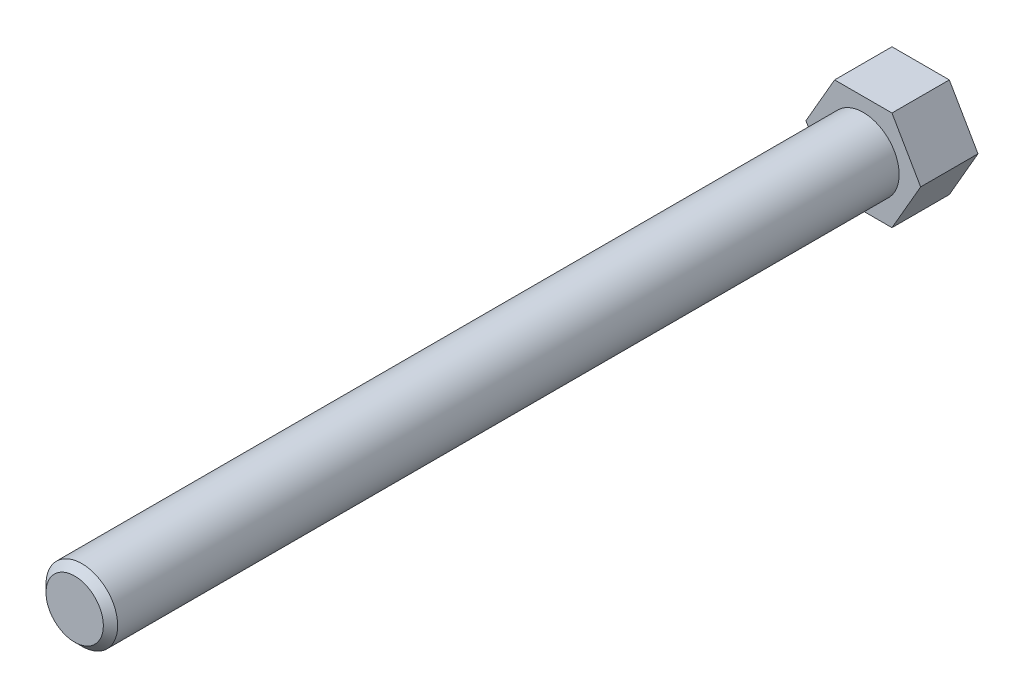
ISO-10303-21;
HEADER;
FILE_DESCRIPTION(('STEP AP214'),'2;1');
FILE_NAME('part.step','',(''),(''),'','','');
FILE_SCHEMA(('AUTOMOTIVE_DESIGN { 1 0 10303 214 1 1 1 1 }'));
ENDSEC;
DATA;
#1=APPLICATION_CONTEXT('core data for automotive mechanical design processes');
#2=APPLICATION_PROTOCOL_DEFINITION('international standard','automotive_design',2000,#1);
#3=PRODUCT_CONTEXT('',#1,'mechanical');
#4=PRODUCT('Part','Part','',(#3));
#5=PRODUCT_RELATED_PRODUCT_CATEGORY('part','',(#4));
#6=PRODUCT_DEFINITION_FORMATION('','',#4);
#7=PRODUCT_DEFINITION_CONTEXT('part definition',#1,'design');
#8=PRODUCT_DEFINITION('design','',#6,#7);
#9=PRODUCT_DEFINITION_SHAPE('','',#8);
#10=(LENGTH_UNIT() NAMED_UNIT(*) SI_UNIT(.MILLI.,.METRE.));
#11=(NAMED_UNIT(*) PLANE_ANGLE_UNIT() SI_UNIT($,.RADIAN.));
#12=(NAMED_UNIT(*) SI_UNIT($,.STERADIAN.) SOLID_ANGLE_UNIT());
#13=UNCERTAINTY_MEASURE_WITH_UNIT(LENGTH_MEASURE(1.E-05),#10,'distance_accuracy_value','');
#14=(GEOMETRIC_REPRESENTATION_CONTEXT(3) GLOBAL_UNCERTAINTY_ASSIGNED_CONTEXT((#13)) GLOBAL_UNIT_ASSIGNED_CONTEXT((#10,
#11,#12)) REPRESENTATION_CONTEXT('',''));
#15=CARTESIAN_POINT('',(0.,0.,0.));
#16=DIRECTION('',(0.,0.,1.));
#17=DIRECTION('',(1.,0.,0.));
#18=AXIS2_PLACEMENT_3D('',#15,#16,#17);
#19=CARTESIAN_POINT('',(0.,0.,55.));
#20=DIRECTION('',(0.,0.,-1.));
#21=DIRECTION('',(-1.,0.,0.));
#22=AXIS2_PLACEMENT_3D('',#19,#20,#21);
#23=CYLINDRICAL_SURFACE('',#22,2.5);
#24=CARTESIAN_POINT('',(0.,0.,54.5));
#25=DIRECTION('',(0.,0.,1.));
#26=DIRECTION('',(1.,0.,0.));
#27=AXIS2_PLACEMENT_3D('',#24,#25,#26);
#28=CIRCLE('',#27,2.5);
#29=CARTESIAN_POINT('',(2.5,0.,54.5));
#30=VERTEX_POINT('',#29);
#31=EDGE_CURVE('E11',#30,#30,#28,.F.);
#32=ORIENTED_EDGE('',*,*,#31,.T.);
#33=EDGE_LOOP('',(#32));
#34=FACE_BOUND('',#33,.T.);
#35=CARTESIAN_POINT('',(0.,0.,0.));
#36=DIRECTION('',(0.,0.,1.));
#37=DIRECTION('',(1.,0.,0.));
#38=AXIS2_PLACEMENT_3D('',#35,#36,#37);
#39=CIRCLE('',#38,2.5);
#40=CARTESIAN_POINT('',(2.5,0.,0.));
#41=VERTEX_POINT('',#40);
#42=EDGE_CURVE('E163',#41,#41,#39,.T.);
#43=ORIENTED_EDGE('',*,*,#42,.T.);
#44=EDGE_LOOP('',(#43));
#45=FACE_BOUND('',#44,.T.);
#46=ADVANCED_FACE('F49',(#34,#45),#23,.T.);
#47=CARTESIAN_POINT('',(0.,0.,55.));
#48=DIRECTION('',(0.,0.,1.));
#49=DIRECTION('',(1.,0.,0.));
#50=AXIS2_PLACEMENT_3D('',#47,#48,#49);
#51=PLANE('',#50);
#52=CARTESIAN_POINT('',(0.,0.,55.));
#53=DIRECTION('',(0.,0.,1.));
#54=DIRECTION('',(1.,0.,0.));
#55=AXIS2_PLACEMENT_3D('',#52,#53,#54);
#56=CIRCLE('',#55,2.);
#57=CARTESIAN_POINT('',(2.,0.,55.));
#58=VERTEX_POINT('',#57);
#59=EDGE_CURVE('E57',#58,#58,#56,.T.);
#60=ORIENTED_EDGE('',*,*,#59,.T.);
#61=EDGE_LOOP('',(#60));
#62=FACE_BOUND('',#61,.T.);
#63=ADVANCED_FACE('F181',(#62),#51,.T.);
#64=CARTESIAN_POINT('',(2.,-3.46410161513776,0.));
#65=DIRECTION('',(0.,0.,1.));
#66=DIRECTION('',(1.,0.,0.));
#67=AXIS2_PLACEMENT_3D('',#64,#65,#66);
#68=PLANE('',#67);
#69=DIRECTION('',(1.,0.,0.));
#70=VECTOR('',#69,1.);
#71=CARTESIAN_POINT('',(-2.,-3.46410161513775,0.));
#72=LINE('',#71,#70);
#73=CARTESIAN_POINT('',(-2.,-3.46410161513775,0.));
#74=VERTEX_POINT('',#73);
#75=CARTESIAN_POINT('',(2.,-3.46410161513776,0.));
#76=VERTEX_POINT('',#75);
#77=EDGE_CURVE('E105',#74,#76,#72,.T.);
#78=ORIENTED_EDGE('',*,*,#77,.T.);
#79=DIRECTION('',(0.5,0.866025403784439,0.));
#80=VECTOR('',#79,1.);
#81=CARTESIAN_POINT('',(2.,-3.46410161513776,0.));
#82=LINE('',#81,#80);
#83=CARTESIAN_POINT('',(4.,0.,0.));
#84=VERTEX_POINT('',#83);
#85=EDGE_CURVE('E116',#76,#84,#82,.T.);
#86=ORIENTED_EDGE('',*,*,#85,.T.);
#87=DIRECTION('',(-0.5,0.866025403784439,0.));
#88=VECTOR('',#87,1.);
#89=CARTESIAN_POINT('',(4.,0.,0.));
#90=LINE('',#89,#88);
#91=CARTESIAN_POINT('',(2.,3.46410161513776,0.));
#92=VERTEX_POINT('',#91);
#93=EDGE_CURVE('E122',#84,#92,#90,.T.);
#94=ORIENTED_EDGE('',*,*,#93,.T.);
#95=DIRECTION('',(-1.,0.,0.));
#96=VECTOR('',#95,1.);
#97=CARTESIAN_POINT('',(2.,3.46410161513776,0.));
#98=LINE('',#97,#96);
#99=CARTESIAN_POINT('',(-2.,3.46410161513776,0.));
#100=VERTEX_POINT('',#99);
#101=EDGE_CURVE('E134',#92,#100,#98,.T.);
#102=ORIENTED_EDGE('',*,*,#101,.T.);
#103=DIRECTION('',(-0.5,-0.866025403784438,0.));
#104=VECTOR('',#103,1.);
#105=CARTESIAN_POINT('',(-2.,3.46410161513776,0.));
#106=LINE('',#105,#104);
#107=CARTESIAN_POINT('',(-4.,0.,0.));
#108=VERTEX_POINT('',#107);
#109=EDGE_CURVE('E138',#100,#108,#106,.T.);
#110=ORIENTED_EDGE('',*,*,#109,.T.);
#111=DIRECTION('',(0.5,-0.866025403784439,0.));
#112=VECTOR('',#111,1.);
#113=CARTESIAN_POINT('',(-4.,0.,0.));
#114=LINE('',#113,#112);
#115=EDGE_CURVE('E127',#108,#74,#114,.T.);
#116=ORIENTED_EDGE('',*,*,#115,.T.);
#117=EDGE_LOOP('',(#78,#86,#94,#102,#110,#116));
#118=FACE_BOUND('',#117,.T.);
#119=ORIENTED_EDGE('',*,*,#42,.F.);
#120=EDGE_LOOP('',(#119));
#121=FACE_BOUND('',#120,.T.);
#122=ADVANCED_FACE('F124',(#118,#121),#68,.T.);
#123=CARTESIAN_POINT('',(-2.,-3.46410161513775,-4.));
#124=DIRECTION('',(0.,-1.,0.));
#125=DIRECTION('',(1.,0.,0.));
#126=AXIS2_PLACEMENT_3D('',#123,#124,#125);
#127=PLANE('',#126);
#128=ORIENTED_EDGE('',*,*,#77,.F.);
#129=DIRECTION('',(0.,0.,1.));
#130=VECTOR('',#129,1.);
#131=CARTESIAN_POINT('',(-2.,-3.46410161513775,-4.));
#132=LINE('',#131,#130);
#133=CARTESIAN_POINT('',(-2.,-3.46410161513775,-4.));
#134=VERTEX_POINT('',#133);
#135=EDGE_CURVE('E64',#134,#74,#132,.T.);
#136=ORIENTED_EDGE('',*,*,#135,.F.);
#137=DIRECTION('',(1.,0.,0.));
#138=VECTOR('',#137,1.);
#139=CARTESIAN_POINT('',(-2.,-3.46410161513775,-4.));
#140=LINE('',#139,#138);
#141=CARTESIAN_POINT('',(2.,-3.46410161513776,-4.));
#142=VERTEX_POINT('',#141);
#143=EDGE_CURVE('E107',#134,#142,#140,.T.);
#144=ORIENTED_EDGE('',*,*,#143,.T.);
#145=DIRECTION('',(0.,0.,1.));
#146=VECTOR('',#145,1.);
#147=CARTESIAN_POINT('',(2.,-3.46410161513776,-4.));
#148=LINE('',#147,#146);
#149=EDGE_CURVE('E101',#142,#76,#148,.T.);
#150=ORIENTED_EDGE('',*,*,#149,.T.);
#151=EDGE_LOOP('',(#128,#136,#144,#150));
#152=FACE_BOUND('',#151,.T.);
#153=ADVANCED_FACE('F103',(#152),#127,.T.);
#154=CARTESIAN_POINT('',(-4.,0.,-4.));
#155=DIRECTION('',(-0.866025403784439,-0.5,0.));
#156=DIRECTION('',(0.5,-0.866025403784439,0.));
#157=AXIS2_PLACEMENT_3D('',#154,#155,#156);
#158=PLANE('',#157);
#159=ORIENTED_EDGE('',*,*,#115,.F.);
#160=DIRECTION('',(0.,0.,1.));
#161=VECTOR('',#160,1.);
#162=CARTESIAN_POINT('',(-4.,0.,-4.));
#163=LINE('',#162,#161);
#164=CARTESIAN_POINT('',(-4.,0.,-4.));
#165=VERTEX_POINT('',#164);
#166=EDGE_CURVE('E72',#165,#108,#163,.T.);
#167=ORIENTED_EDGE('',*,*,#166,.F.);
#168=DIRECTION('',(0.5,-0.866025403784439,0.));
#169=VECTOR('',#168,1.);
#170=CARTESIAN_POINT('',(-4.,0.,-4.));
#171=LINE('',#170,#169);
#172=EDGE_CURVE('E113',#165,#134,#171,.T.);
#173=ORIENTED_EDGE('',*,*,#172,.T.);
#174=ORIENTED_EDGE('',*,*,#135,.T.);
#175=EDGE_LOOP('',(#159,#167,#173,#174));
#176=FACE_BOUND('',#175,.T.);
#177=ADVANCED_FACE('F206',(#176),#158,.T.);
#178=CARTESIAN_POINT('',(-2.,3.46410161513776,-4.));
#179=DIRECTION('',(-0.866025403784438,0.5,0.));
#180=DIRECTION('',(-0.5,-0.866025403784439,0.));
#181=AXIS2_PLACEMENT_3D('',#178,#179,#180);
#182=PLANE('',#181);
#183=ORIENTED_EDGE('',*,*,#109,.F.);
#184=DIRECTION('',(0.,0.,1.));
#185=VECTOR('',#184,1.);
#186=CARTESIAN_POINT('',(-2.,3.46410161513776,-4.));
#187=LINE('',#186,#185);
#188=CARTESIAN_POINT('',(-2.,3.46410161513776,-4.));
#189=VERTEX_POINT('',#188);
#190=EDGE_CURVE('E166',#189,#100,#187,.T.);
#191=ORIENTED_EDGE('',*,*,#190,.F.);
#192=DIRECTION('',(-0.5,-0.866025403784438,0.));
#193=VECTOR('',#192,1.);
#194=CARTESIAN_POINT('',(-2.,3.46410161513776,-4.));
#195=LINE('',#194,#193);
#196=EDGE_CURVE('E156',#189,#165,#195,.T.);
#197=ORIENTED_EDGE('',*,*,#196,.T.);
#198=ORIENTED_EDGE('',*,*,#166,.T.);
#199=EDGE_LOOP('',(#183,#191,#197,#198));
#200=FACE_BOUND('',#199,.T.);
#201=ADVANCED_FACE('F211',(#200),#182,.T.);
#202=CARTESIAN_POINT('',(2.,3.46410161513776,-4.));
#203=DIRECTION('',(0.,1.,0.));
#204=DIRECTION('',(-1.,0.,0.));
#205=AXIS2_PLACEMENT_3D('',#202,#203,#204);
#206=PLANE('',#205);
#207=ORIENTED_EDGE('',*,*,#101,.F.);
#208=DIRECTION('',(0.,0.,1.));
#209=VECTOR('',#208,1.);
#210=CARTESIAN_POINT('',(2.,3.46410161513776,-4.));
#211=LINE('',#210,#209);
#212=CARTESIAN_POINT('',(2.,3.46410161513776,-4.));
#213=VERTEX_POINT('',#212);
#214=EDGE_CURVE('E169',#213,#92,#211,.T.);
#215=ORIENTED_EDGE('',*,*,#214,.F.);
#216=DIRECTION('',(-1.,0.,0.));
#217=VECTOR('',#216,1.);
#218=CARTESIAN_POINT('',(2.,3.46410161513776,-4.));
#219=LINE('',#218,#217);
#220=EDGE_CURVE('E152',#213,#189,#219,.T.);
#221=ORIENTED_EDGE('',*,*,#220,.T.);
#222=ORIENTED_EDGE('',*,*,#190,.T.);
#223=EDGE_LOOP('',(#207,#215,#221,#222));
#224=FACE_BOUND('',#223,.T.);
#225=ADVANCED_FACE('F214',(#224),#206,.T.);
#226=CARTESIAN_POINT('',(4.,0.,-4.));
#227=DIRECTION('',(0.866025403784439,0.5,0.));
#228=DIRECTION('',(-0.5,0.866025403784439,0.));
#229=AXIS2_PLACEMENT_3D('',#226,#227,#228);
#230=PLANE('',#229);
#231=ORIENTED_EDGE('',*,*,#93,.F.);
#232=DIRECTION('',(0.,0.,1.));
#233=VECTOR('',#232,1.);
#234=CARTESIAN_POINT('',(4.,0.,-4.));
#235=LINE('',#234,#233);
#236=CARTESIAN_POINT('',(4.,0.,-4.));
#237=VERTEX_POINT('',#236);
#238=EDGE_CURVE('E112',#237,#84,#235,.T.);
#239=ORIENTED_EDGE('',*,*,#238,.F.);
#240=DIRECTION('',(-0.5,0.866025403784439,0.));
#241=VECTOR('',#240,1.);
#242=CARTESIAN_POINT('',(4.,0.,-4.));
#243=LINE('',#242,#241);
#244=EDGE_CURVE('E148',#237,#213,#243,.T.);
#245=ORIENTED_EDGE('',*,*,#244,.T.);
#246=ORIENTED_EDGE('',*,*,#214,.T.);
#247=EDGE_LOOP('',(#231,#239,#245,#246));
#248=FACE_BOUND('',#247,.T.);
#249=ADVANCED_FACE('F218',(#248),#230,.T.);
#250=CARTESIAN_POINT('',(2.,-3.46410161513776,-4.));
#251=DIRECTION('',(0.866025403784439,-0.5,0.));
#252=DIRECTION('',(0.5,0.866025403784439,0.));
#253=AXIS2_PLACEMENT_3D('',#250,#251,#252);
#254=PLANE('',#253);
#255=ORIENTED_EDGE('',*,*,#85,.F.);
#256=ORIENTED_EDGE('',*,*,#149,.F.);
#257=DIRECTION('',(0.5,0.866025403784439,0.));
#258=VECTOR('',#257,1.);
#259=CARTESIAN_POINT('',(2.,-3.46410161513776,-4.));
#260=LINE('',#259,#258);
#261=EDGE_CURVE('E145',#142,#237,#260,.T.);
#262=ORIENTED_EDGE('',*,*,#261,.T.);
#263=ORIENTED_EDGE('',*,*,#238,.T.);
#264=EDGE_LOOP('',(#255,#256,#262,#263));
#265=FACE_BOUND('',#264,.T.);
#266=ADVANCED_FACE('F117',(#265),#254,.T.);
#267=CARTESIAN_POINT('',(2.,-3.46410161513776,-4.));
#268=DIRECTION('',(0.,0.,1.));
#269=DIRECTION('',(1.,0.,0.));
#270=AXIS2_PLACEMENT_3D('',#267,#268,#269);
#271=PLANE('',#270);
#272=ORIENTED_EDGE('',*,*,#143,.F.);
#273=ORIENTED_EDGE('',*,*,#172,.F.);
#274=ORIENTED_EDGE('',*,*,#196,.F.);
#275=ORIENTED_EDGE('',*,*,#220,.F.);
#276=ORIENTED_EDGE('',*,*,#244,.F.);
#277=ORIENTED_EDGE('',*,*,#261,.F.);
#278=EDGE_LOOP('',(#272,#273,#274,#275,#276,#277));
#279=FACE_BOUND('',#278,.T.);
#280=ADVANCED_FACE('F185',(#279),#271,.F.);
#281=CARTESIAN_POINT('',(0.,0.,55.));
#282=DIRECTION('',(0.,0.,-1.));
#283=DIRECTION('',(-1.,0.,0.));
#284=AXIS2_PLACEMENT_3D('',#281,#282,#283);
#285=CONICAL_SURFACE('',#284,2.,0.785398163397448);
#286=ORIENTED_EDGE('',*,*,#31,.F.);
#287=EDGE_LOOP('',(#286));
#288=FACE_BOUND('',#287,.T.);
#289=ORIENTED_EDGE('',*,*,#59,.F.);
#290=EDGE_LOOP('',(#289));
#291=FACE_BOUND('',#290,.T.);
#292=ADVANCED_FACE('F183',(#288,#291),#285,.T.);
#293=CLOSED_SHELL('',(#46,#63,#122,#153,#177,#201,#225,#249,#266,#280,#292));
#294=MANIFOLD_SOLID_BREP('B2',#293);
#295=ADVANCED_BREP_SHAPE_REPRESENTATION('',(#18,#294),#14);
#296=SHAPE_DEFINITION_REPRESENTATION(#9,#295);
ENDSEC;
END-ISO-10303-21;
